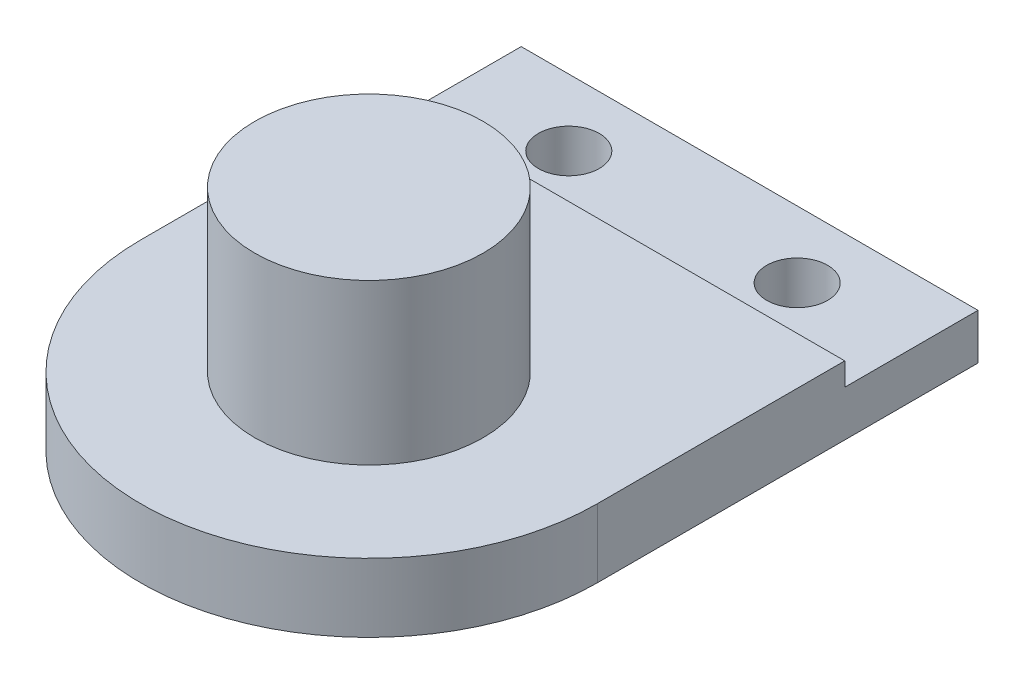
ISO-10303-21;
HEADER;
FILE_DESCRIPTION(('STEP AP214'),'2;1');
FILE_NAME('part.step','',(''),(''),'','','');
FILE_SCHEMA(('AUTOMOTIVE_DESIGN { 1 0 10303 214 1 1 1 1 }'));
ENDSEC;
DATA;
#1=APPLICATION_CONTEXT('core data for automotive mechanical design processes');
#2=APPLICATION_PROTOCOL_DEFINITION('international standard','automotive_design',2000,#1);
#3=PRODUCT_CONTEXT('',#1,'mechanical');
#4=PRODUCT('Part','Part','',(#3));
#5=PRODUCT_RELATED_PRODUCT_CATEGORY('part','',(#4));
#6=PRODUCT_DEFINITION_FORMATION('','',#4);
#7=PRODUCT_DEFINITION_CONTEXT('part definition',#1,'design');
#8=PRODUCT_DEFINITION('design','',#6,#7);
#9=PRODUCT_DEFINITION_SHAPE('','',#8);
#10=(LENGTH_UNIT() NAMED_UNIT(*) SI_UNIT(.MILLI.,.METRE.));
#11=(NAMED_UNIT(*) PLANE_ANGLE_UNIT() SI_UNIT($,.RADIAN.));
#12=(NAMED_UNIT(*) SI_UNIT($,.STERADIAN.) SOLID_ANGLE_UNIT());
#13=UNCERTAINTY_MEASURE_WITH_UNIT(LENGTH_MEASURE(1.E-05),#10,'distance_accuracy_value','');
#14=(GEOMETRIC_REPRESENTATION_CONTEXT(3) GLOBAL_UNCERTAINTY_ASSIGNED_CONTEXT((#13)) GLOBAL_UNIT_ASSIGNED_CONTEXT((#10,
#11,#12)) REPRESENTATION_CONTEXT('',''));
#15=CARTESIAN_POINT('',(0.,0.,0.));
#16=DIRECTION('',(0.,0.,1.));
#17=DIRECTION('',(1.,0.,0.));
#18=AXIS2_PLACEMENT_3D('',#15,#16,#17);
#19=CARTESIAN_POINT('',(-3.4655172413793,1.8,-4.74137931034483));
#20=DIRECTION('',(0.,0.,1.));
#21=DIRECTION('',(1.,0.,0.));
#22=AXIS2_PLACEMENT_3D('',#19,#20,#21);
#23=PLANE('',#22);
#24=DIRECTION('',(-1.,0.,0.));
#25=VECTOR('',#24,1.);
#26=CARTESIAN_POINT('',(-3.4655172413793,1.2,-4.74137931034483));
#27=LINE('',#26,#25);
#28=CARTESIAN_POINT('',(8.5344827586207,1.2,-4.74137931034483));
#29=VERTEX_POINT('',#28);
#30=CARTESIAN_POINT('',(-3.4655172413793,1.2,-4.74137931034483));
#31=VERTEX_POINT('',#30);
#32=EDGE_CURVE('E125',#29,#31,#27,.T.);
#33=ORIENTED_EDGE('',*,*,#32,.F.);
#34=DIRECTION('',(0.,-1.,0.));
#35=VECTOR('',#34,1.);
#36=CARTESIAN_POINT('',(8.5344827586207,1.8,-4.74137931034483));
#37=LINE('',#36,#35);
#38=CARTESIAN_POINT('',(8.5344827586207,0.,-4.74137931034483));
#39=VERTEX_POINT('',#38);
#40=EDGE_CURVE('E92',#29,#39,#37,.T.);
#41=ORIENTED_EDGE('',*,*,#40,.T.);
#42=DIRECTION('',(-1.,0.,0.));
#43=VECTOR('',#42,1.);
#44=CARTESIAN_POINT('',(-3.4655172413793,0.,-4.74137931034483));
#45=LINE('',#44,#43);
#46=CARTESIAN_POINT('',(-3.4655172413793,0.,-4.74137931034483));
#47=VERTEX_POINT('',#46);
#48=EDGE_CURVE('E96',#39,#47,#45,.T.);
#49=ORIENTED_EDGE('',*,*,#48,.T.);
#50=DIRECTION('',(0.,-1.,0.));
#51=VECTOR('',#50,1.);
#52=CARTESIAN_POINT('',(-3.4655172413793,1.8,-4.74137931034483));
#53=LINE('',#52,#51);
#54=EDGE_CURVE('E82',#31,#47,#53,.T.);
#55=ORIENTED_EDGE('',*,*,#54,.F.);
#56=EDGE_LOOP('',(#33,#41,#49,#55));
#57=FACE_BOUND('',#56,.T.);
#58=ADVANCED_FACE('F37',(#57),#23,.F.);
#59=CARTESIAN_POINT('',(-3.4655172413793,1.8,-4.74137931034483));
#60=DIRECTION('',(1.,0.,0.));
#61=DIRECTION('',(0.,0.,-1.));
#62=AXIS2_PLACEMENT_3D('',#59,#60,#61);
#63=PLANE('',#62);
#64=DIRECTION('',(0.,0.,1.));
#65=VECTOR('',#64,1.);
#66=CARTESIAN_POINT('',(-3.4655172413793,1.8,-4.74137931034483));
#67=LINE('',#66,#65);
#68=CARTESIAN_POINT('',(-3.4655172413793,1.8,-1.24137931034483));
#69=VERTEX_POINT('',#68);
#70=CARTESIAN_POINT('',(-3.4655172413793,1.8,5.25862068965517));
#71=VERTEX_POINT('',#70);
#72=EDGE_CURVE('E101',#69,#71,#67,.T.);
#73=ORIENTED_EDGE('',*,*,#72,.F.);
#74=DIRECTION('',(0.,1.,0.));
#75=VECTOR('',#74,1.);
#76=CARTESIAN_POINT('',(-3.4655172413793,1.2,-1.24137931034483));
#77=LINE('',#76,#75);
#78=CARTESIAN_POINT('',(-3.4655172413793,1.2,-1.24137931034483));
#79=VERTEX_POINT('',#78);
#80=EDGE_CURVE('E53',#79,#69,#77,.T.);
#81=ORIENTED_EDGE('',*,*,#80,.F.);
#82=DIRECTION('',(0.,0.,1.));
#83=VECTOR('',#82,1.);
#84=CARTESIAN_POINT('',(-3.4655172413793,1.2,-4.74137931034483));
#85=LINE('',#84,#83);
#86=EDGE_CURVE('E89',#31,#79,#85,.T.);
#87=ORIENTED_EDGE('',*,*,#86,.F.);
#88=ORIENTED_EDGE('',*,*,#54,.T.);
#89=DIRECTION('',(0.,0.,1.));
#90=VECTOR('',#89,1.);
#91=CARTESIAN_POINT('',(-3.4655172413793,0.,-4.74137931034483));
#92=LINE('',#91,#90);
#93=CARTESIAN_POINT('',(-3.4655172413793,0.,5.25862068965517));
#94=VERTEX_POINT('',#93);
#95=EDGE_CURVE('E87',#47,#94,#92,.T.);
#96=ORIENTED_EDGE('',*,*,#95,.T.);
#97=DIRECTION('',(0.,-1.,0.));
#98=VECTOR('',#97,1.);
#99=CARTESIAN_POINT('',(-3.4655172413793,1.8,5.25862068965517));
#100=LINE('',#99,#98);
#101=EDGE_CURVE('E41',#71,#94,#100,.T.);
#102=ORIENTED_EDGE('',*,*,#101,.F.);
#103=EDGE_LOOP('',(#73,#81,#87,#88,#96,#102));
#104=FACE_BOUND('',#103,.T.);
#105=ADVANCED_FACE('F39',(#104),#63,.F.);
#106=CARTESIAN_POINT('',(2.5344827586207,1.8,5.25862068965517));
#107=DIRECTION('',(0.,-1.,0.));
#108=DIRECTION('',(0.,0.,-1.));
#109=AXIS2_PLACEMENT_3D('',#106,#107,#108);
#110=CYLINDRICAL_SURFACE('',#109,6.);
#111=CARTESIAN_POINT('',(2.5344827586207,0.,5.25862068965517));
#112=DIRECTION('',(0.,1.,0.));
#113=DIRECTION('',(0.,0.,1.));
#114=AXIS2_PLACEMENT_3D('',#111,#112,#113);
#115=CIRCLE('',#114,6.);
#116=CARTESIAN_POINT('',(8.5344827586207,0.,5.25862068965517));
#117=VERTEX_POINT('',#116);
#118=EDGE_CURVE('E105',#94,#117,#115,.T.);
#119=ORIENTED_EDGE('',*,*,#118,.T.);
#120=DIRECTION('',(0.,-1.,0.));
#121=VECTOR('',#120,1.);
#122=CARTESIAN_POINT('',(8.5344827586207,1.8,5.25862068965517));
#123=LINE('',#122,#121);
#124=CARTESIAN_POINT('',(8.5344827586207,1.8,5.25862068965517));
#125=VERTEX_POINT('',#124);
#126=EDGE_CURVE('E116',#125,#117,#123,.T.);
#127=ORIENTED_EDGE('',*,*,#126,.F.);
#128=CARTESIAN_POINT('',(2.5344827586207,1.8,5.25862068965517));
#129=DIRECTION('',(0.,1.,0.));
#130=DIRECTION('',(0.,0.,1.));
#131=AXIS2_PLACEMENT_3D('',#128,#129,#130);
#132=CIRCLE('',#131,6.);
#133=EDGE_CURVE('E62',#71,#125,#132,.T.);
#134=ORIENTED_EDGE('',*,*,#133,.F.);
#135=ORIENTED_EDGE('',*,*,#101,.T.);
#136=EDGE_LOOP('',(#119,#127,#134,#135));
#137=FACE_BOUND('',#136,.T.);
#138=ADVANCED_FACE('F121',(#137),#110,.T.);
#139=CARTESIAN_POINT('',(8.5344827586207,1.8,-4.74137931034483));
#140=DIRECTION('',(-1.,0.,0.));
#141=DIRECTION('',(0.,0.,1.));
#142=AXIS2_PLACEMENT_3D('',#139,#140,#141);
#143=PLANE('',#142);
#144=DIRECTION('',(0.,0.,-1.));
#145=VECTOR('',#144,1.);
#146=CARTESIAN_POINT('',(8.5344827586207,1.2,-4.74137931034483));
#147=LINE('',#146,#145);
#148=CARTESIAN_POINT('',(8.5344827586207,1.2,-1.24137931034483));
#149=VERTEX_POINT('',#148);
#150=EDGE_CURVE('E132',#149,#29,#147,.T.);
#151=ORIENTED_EDGE('',*,*,#150,.F.);
#152=DIRECTION('',(0.,1.,0.));
#153=VECTOR('',#152,1.);
#154=CARTESIAN_POINT('',(8.5344827586207,1.2,-1.24137931034483));
#155=LINE('',#154,#153);
#156=CARTESIAN_POINT('',(8.5344827586207,1.8,-1.24137931034483));
#157=VERTEX_POINT('',#156);
#158=EDGE_CURVE('E107',#149,#157,#155,.T.);
#159=ORIENTED_EDGE('',*,*,#158,.T.);
#160=DIRECTION('',(0.,0.,-1.));
#161=VECTOR('',#160,1.);
#162=CARTESIAN_POINT('',(8.5344827586207,1.8,-4.74137931034483));
#163=LINE('',#162,#161);
#164=EDGE_CURVE('E93',#125,#157,#163,.T.);
#165=ORIENTED_EDGE('',*,*,#164,.F.);
#166=ORIENTED_EDGE('',*,*,#126,.T.);
#167=DIRECTION('',(0.,0.,-1.));
#168=VECTOR('',#167,1.);
#169=CARTESIAN_POINT('',(8.5344827586207,0.,-4.74137931034483));
#170=LINE('',#169,#168);
#171=EDGE_CURVE('E102',#117,#39,#170,.T.);
#172=ORIENTED_EDGE('',*,*,#171,.T.);
#173=ORIENTED_EDGE('',*,*,#40,.F.);
#174=EDGE_LOOP('',(#151,#159,#165,#166,#172,#173));
#175=FACE_BOUND('',#174,.T.);
#176=ADVANCED_FACE('F180',(#175),#143,.F.);
#177=CARTESIAN_POINT('',(2.5344827586207,1.8,5.25862068965517));
#178=DIRECTION('',(0.,1.,0.));
#179=DIRECTION('',(0.,0.,1.));
#180=AXIS2_PLACEMENT_3D('',#177,#178,#179);
#181=PLANE('',#180);
#182=CARTESIAN_POINT('',(2.5344827586207,1.8,5.25862068965517));
#183=DIRECTION('',(0.,1.,0.));
#184=DIRECTION('',(0.,0.,1.));
#185=AXIS2_PLACEMENT_3D('',#182,#183,#184);
#186=CIRCLE('',#185,3.);
#187=CARTESIAN_POINT('',(2.5344827586207,1.8,8.25862068965517));
#188=VERTEX_POINT('',#187);
#189=EDGE_CURVE('E11',#188,#188,#186,.T.);
#190=ORIENTED_EDGE('',*,*,#189,.F.);
#191=EDGE_LOOP('',(#190));
#192=FACE_BOUND('',#191,.T.);
#193=DIRECTION('',(1.,0.,0.));
#194=VECTOR('',#193,1.);
#195=CARTESIAN_POINT('',(-3.4655172413793,1.8,-1.24137931034483));
#196=LINE('',#195,#194);
#197=EDGE_CURVE('E127',#69,#157,#196,.T.);
#198=ORIENTED_EDGE('',*,*,#197,.F.);
#199=ORIENTED_EDGE('',*,*,#72,.T.);
#200=ORIENTED_EDGE('',*,*,#133,.T.);
#201=ORIENTED_EDGE('',*,*,#164,.T.);
#202=EDGE_LOOP('',(#198,#199,#200,#201));
#203=FACE_BOUND('',#202,.T.);
#204=ADVANCED_FACE('F182',(#192,#203),#181,.T.);
#205=CARTESIAN_POINT('',(2.5344827586207,0.,5.25862068965517));
#206=DIRECTION('',(0.,1.,0.));
#207=DIRECTION('',(0.,0.,1.));
#208=AXIS2_PLACEMENT_3D('',#205,#206,#207);
#209=PLANE('',#208);
#210=CARTESIAN_POINT('',(5.5344827586207,0.,-2.99137931034483));
#211=DIRECTION('',(0.,1.,0.));
#212=DIRECTION('',(0.,0.,1.));
#213=AXIS2_PLACEMENT_3D('',#210,#211,#212);
#214=CIRCLE('',#213,0.800000000000001);
#215=CARTESIAN_POINT('',(5.5344827586207,0.,-2.19137931034483));
#216=VERTEX_POINT('',#215);
#217=EDGE_CURVE('E141',#216,#216,#214,.T.);
#218=ORIENTED_EDGE('',*,*,#217,.T.);
#219=EDGE_LOOP('',(#218));
#220=FACE_BOUND('',#219,.T.);
#221=CARTESIAN_POINT('',(-0.465517241379303,0.,-2.99137931034483));
#222=DIRECTION('',(0.,1.,0.));
#223=DIRECTION('',(0.,0.,-1.));
#224=AXIS2_PLACEMENT_3D('',#221,#222,#223);
#225=CIRCLE('',#224,0.800000000000001);
#226=CARTESIAN_POINT('',(-0.465517241379303,0.,-3.79137931034483));
#227=VERTEX_POINT('',#226);
#228=EDGE_CURVE('E142',#227,#227,#225,.T.);
#229=ORIENTED_EDGE('',*,*,#228,.T.);
#230=EDGE_LOOP('',(#229));
#231=FACE_BOUND('',#230,.T.);
#232=ORIENTED_EDGE('',*,*,#95,.F.);
#233=ORIENTED_EDGE('',*,*,#48,.F.);
#234=ORIENTED_EDGE('',*,*,#171,.F.);
#235=ORIENTED_EDGE('',*,*,#118,.F.);
#236=EDGE_LOOP('',(#232,#233,#234,#235));
#237=FACE_BOUND('',#236,.T.);
#238=ADVANCED_FACE('F104',(#220,#231,#237),#209,.F.);
#239=CARTESIAN_POINT('',(-3.4655172413793,1.2,-1.24137931034483));
#240=DIRECTION('',(0.,0.,1.));
#241=DIRECTION('',(1.,0.,0.));
#242=AXIS2_PLACEMENT_3D('',#239,#240,#241);
#243=PLANE('',#242);
#244=ORIENTED_EDGE('',*,*,#197,.T.);
#245=ORIENTED_EDGE('',*,*,#158,.F.);
#246=DIRECTION('',(1.,0.,0.));
#247=VECTOR('',#246,1.);
#248=CARTESIAN_POINT('',(-3.4655172413793,1.2,-1.24137931034483));
#249=LINE('',#248,#247);
#250=EDGE_CURVE('E135',#79,#149,#249,.T.);
#251=ORIENTED_EDGE('',*,*,#250,.F.);
#252=ORIENTED_EDGE('',*,*,#80,.T.);
#253=EDGE_LOOP('',(#244,#245,#251,#252));
#254=FACE_BOUND('',#253,.T.);
#255=ADVANCED_FACE('F167',(#254),#243,.F.);
#256=CARTESIAN_POINT('',(0.,1.2,0.));
#257=DIRECTION('',(0.,1.,0.));
#258=DIRECTION('',(0.,0.,1.));
#259=AXIS2_PLACEMENT_3D('',#256,#257,#258);
#260=PLANE('',#259);
#261=CARTESIAN_POINT('',(5.5344827586207,1.2,-2.99137931034483));
#262=DIRECTION('',(0.,1.,0.));
#263=DIRECTION('',(0.,0.,1.));
#264=AXIS2_PLACEMENT_3D('',#261,#262,#263);
#265=CIRCLE('',#264,0.800000000000001);
#266=CARTESIAN_POINT('',(5.5344827586207,1.2,-2.19137931034483));
#267=VERTEX_POINT('',#266);
#268=EDGE_CURVE('E148',#267,#267,#265,.T.);
#269=ORIENTED_EDGE('',*,*,#268,.F.);
#270=EDGE_LOOP('',(#269));
#271=FACE_BOUND('',#270,.T.);
#272=CARTESIAN_POINT('',(-0.465517241379303,1.2,-2.99137931034483));
#273=DIRECTION('',(0.,1.,0.));
#274=DIRECTION('',(0.,0.,-1.));
#275=AXIS2_PLACEMENT_3D('',#272,#273,#274);
#276=CIRCLE('',#275,0.800000000000001);
#277=CARTESIAN_POINT('',(-0.465517241379303,1.2,-3.79137931034483));
#278=VERTEX_POINT('',#277);
#279=EDGE_CURVE('E145',#278,#278,#276,.T.);
#280=ORIENTED_EDGE('',*,*,#279,.F.);
#281=EDGE_LOOP('',(#280));
#282=FACE_BOUND('',#281,.T.);
#283=ORIENTED_EDGE('',*,*,#86,.T.);
#284=ORIENTED_EDGE('',*,*,#250,.T.);
#285=ORIENTED_EDGE('',*,*,#150,.T.);
#286=ORIENTED_EDGE('',*,*,#32,.T.);
#287=EDGE_LOOP('',(#283,#284,#285,#286));
#288=FACE_BOUND('',#287,.T.);
#289=ADVANCED_FACE('F163',(#271,#282,#288),#260,.T.);
#290=CARTESIAN_POINT('',(2.5344827586207,6.,5.25862068965517));
#291=DIRECTION('',(0.,-1.,0.));
#292=DIRECTION('',(0.,0.,-1.));
#293=AXIS2_PLACEMENT_3D('',#290,#291,#292);
#294=CYLINDRICAL_SURFACE('',#293,3.);
#295=CARTESIAN_POINT('',(2.5344827586207,6.,5.25862068965517));
#296=DIRECTION('',(0.,1.,0.));
#297=DIRECTION('',(0.,0.,1.));
#298=AXIS2_PLACEMENT_3D('',#295,#296,#297);
#299=CIRCLE('',#298,3.);
#300=CARTESIAN_POINT('',(2.5344827586207,6.,8.25862068965517));
#301=VERTEX_POINT('',#300);
#302=EDGE_CURVE('E129',#301,#301,#299,.T.);
#303=ORIENTED_EDGE('',*,*,#302,.F.);
#304=EDGE_LOOP('',(#303));
#305=FACE_BOUND('',#304,.T.);
#306=ORIENTED_EDGE('',*,*,#189,.T.);
#307=EDGE_LOOP('',(#306));
#308=FACE_BOUND('',#307,.T.);
#309=ADVANCED_FACE('F166',(#305,#308),#294,.T.);
#310=CARTESIAN_POINT('',(2.5344827586207,6.,5.25862068965517));
#311=DIRECTION('',(0.,1.,0.));
#312=DIRECTION('',(0.,0.,1.));
#313=AXIS2_PLACEMENT_3D('',#310,#311,#312);
#314=PLANE('',#313);
#315=ORIENTED_EDGE('',*,*,#302,.T.);
#316=EDGE_LOOP('',(#315));
#317=FACE_BOUND('',#316,.T.);
#318=ADVANCED_FACE('F202',(#317),#314,.T.);
#319=CARTESIAN_POINT('',(-0.465517241379303,0.,-2.99137931034483));
#320=DIRECTION('',(0.,1.,0.));
#321=DIRECTION('',(0.,0.,1.));
#322=AXIS2_PLACEMENT_3D('',#319,#320,#321);
#323=CYLINDRICAL_SURFACE('',#322,0.800000000000001);
#324=ORIENTED_EDGE('',*,*,#228,.F.);
#325=EDGE_LOOP('',(#324));
#326=FACE_BOUND('',#325,.T.);
#327=ORIENTED_EDGE('',*,*,#279,.T.);
#328=EDGE_LOOP('',(#327));
#329=FACE_BOUND('',#328,.T.);
#330=ADVANCED_FACE('F159',(#326,#329),#323,.F.);
#331=CARTESIAN_POINT('',(5.5344827586207,0.,-2.99137931034483));
#332=DIRECTION('',(0.,1.,0.));
#333=DIRECTION('',(0.,0.,1.));
#334=AXIS2_PLACEMENT_3D('',#331,#332,#333);
#335=CYLINDRICAL_SURFACE('',#334,0.800000000000001);
#336=ORIENTED_EDGE('',*,*,#217,.F.);
#337=EDGE_LOOP('',(#336));
#338=FACE_BOUND('',#337,.T.);
#339=ORIENTED_EDGE('',*,*,#268,.T.);
#340=EDGE_LOOP('',(#339));
#341=FACE_BOUND('',#340,.T.);
#342=ADVANCED_FACE('F156',(#338,#341),#335,.F.);
#343=CLOSED_SHELL('',(#58,#105,#138,#176,#204,#238,#255,#289,#309,#318,#330,#342));
#344=MANIFOLD_SOLID_BREP('B2',#343);
#345=ADVANCED_BREP_SHAPE_REPRESENTATION('',(#18,#344),#14);
#346=SHAPE_DEFINITION_REPRESENTATION(#9,#345);
ENDSEC;
END-ISO-10303-21;
